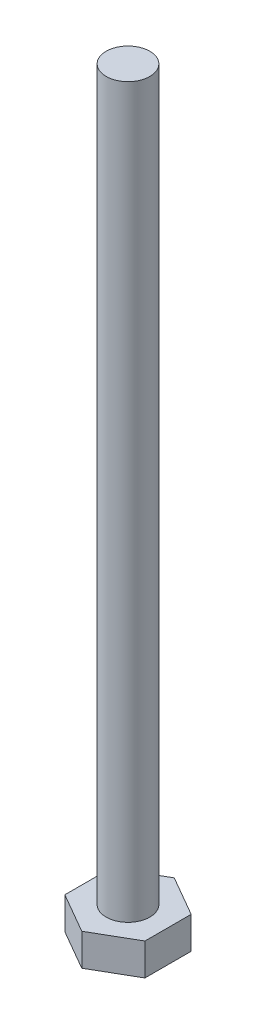
ISO-10303-21;
HEADER;
FILE_DESCRIPTION(('STEP AP214'),'2;1');
FILE_NAME('part.step','',(''),(''),'','','');
FILE_SCHEMA(('AUTOMOTIVE_DESIGN { 1 0 10303 214 1 1 1 1 }'));
ENDSEC;
DATA;
#1=APPLICATION_CONTEXT('core data for automotive mechanical design processes');
#2=APPLICATION_PROTOCOL_DEFINITION('international standard','automotive_design',2000,#1);
#3=PRODUCT_CONTEXT('',#1,'mechanical');
#4=PRODUCT('Part','Part','',(#3));
#5=PRODUCT_RELATED_PRODUCT_CATEGORY('part','',(#4));
#6=PRODUCT_DEFINITION_FORMATION('','',#4);
#7=PRODUCT_DEFINITION_CONTEXT('part definition',#1,'design');
#8=PRODUCT_DEFINITION('design','',#6,#7);
#9=PRODUCT_DEFINITION_SHAPE('','',#8);
#10=(LENGTH_UNIT() NAMED_UNIT(*) SI_UNIT(.MILLI.,.METRE.));
#11=(NAMED_UNIT(*) PLANE_ANGLE_UNIT() SI_UNIT($,.RADIAN.));
#12=(NAMED_UNIT(*) SI_UNIT($,.STERADIAN.) SOLID_ANGLE_UNIT());
#13=UNCERTAINTY_MEASURE_WITH_UNIT(LENGTH_MEASURE(1.E-05),#10,'distance_accuracy_value','');
#14=(GEOMETRIC_REPRESENTATION_CONTEXT(3) GLOBAL_UNCERTAINTY_ASSIGNED_CONTEXT((#13)) GLOBAL_UNIT_ASSIGNED_CONTEXT((#10,
#11,#12)) REPRESENTATION_CONTEXT('',''));
#15=CARTESIAN_POINT('',(0.,0.,0.));
#16=DIRECTION('',(0.,0.,1.));
#17=DIRECTION('',(1.,0.,0.));
#18=AXIS2_PLACEMENT_3D('',#15,#16,#17);
#19=CARTESIAN_POINT('',(0.,50.,0.));
#20=DIRECTION('',(0.,-1.,0.));
#21=DIRECTION('',(0.,0.,-1.));
#22=AXIS2_PLACEMENT_3D('',#19,#20,#21);
#23=CYLINDRICAL_SURFACE('',#22,1.5);
#24=CARTESIAN_POINT('',(0.,50.,0.));
#25=DIRECTION('',(0.,1.,0.));
#26=DIRECTION('',(0.,0.,1.));
#27=AXIS2_PLACEMENT_3D('',#24,#25,#26);
#28=CIRCLE('',#27,1.5);
#29=CARTESIAN_POINT('',(0.,50.,1.5));
#30=VERTEX_POINT('',#29);
#31=EDGE_CURVE('E11',#30,#30,#28,.T.);
#32=ORIENTED_EDGE('',*,*,#31,.F.);
#33=EDGE_LOOP('',(#32));
#34=FACE_BOUND('',#33,.T.);
#35=CARTESIAN_POINT('',(0.,0.,0.));
#36=DIRECTION('',(0.,1.,0.));
#37=DIRECTION('',(0.,0.,1.));
#38=AXIS2_PLACEMENT_3D('',#35,#36,#37);
#39=CIRCLE('',#38,1.5);
#40=CARTESIAN_POINT('',(0.,0.,1.5));
#41=VERTEX_POINT('',#40);
#42=EDGE_CURVE('E45',#41,#41,#39,.T.);
#43=ORIENTED_EDGE('',*,*,#42,.T.);
#44=EDGE_LOOP('',(#43));
#45=FACE_BOUND('',#44,.T.);
#46=ADVANCED_FACE('F37',(#34,#45),#23,.T.);
#47=CARTESIAN_POINT('',(0.,50.,0.));
#48=DIRECTION('',(0.,1.,0.));
#49=DIRECTION('',(0.,0.,1.));
#50=AXIS2_PLACEMENT_3D('',#47,#48,#49);
#51=PLANE('',#50);
#52=ORIENTED_EDGE('',*,*,#31,.T.);
#53=EDGE_LOOP('',(#52));
#54=FACE_BOUND('',#53,.T.);
#55=ADVANCED_FACE('F166',(#54),#51,.T.);
#56=CARTESIAN_POINT('',(-2.75000000000002,-2.2,0.));
#57=DIRECTION('',(-1.,0.,0.));
#58=DIRECTION('',(0.,0.,1.));
#59=AXIS2_PLACEMENT_3D('',#56,#57,#58);
#60=PLANE('',#59);
#61=DIRECTION('',(0.,0.,1.));
#62=VECTOR('',#61,1.);
#63=CARTESIAN_POINT('',(-2.75000000000002,0.,0.));
#64=LINE('',#63,#62);
#65=CARTESIAN_POINT('',(-2.75000000000002,0.,-1.58771324027148));
#66=VERTEX_POINT('',#65);
#67=CARTESIAN_POINT('',(-2.75000000000002,0.,1.58771324027148));
#68=VERTEX_POINT('',#67);
#69=EDGE_CURVE('E124',#66,#68,#64,.T.);
#70=ORIENTED_EDGE('',*,*,#69,.F.);
#71=DIRECTION('',(0.,1.,0.));
#72=VECTOR('',#71,1.);
#73=CARTESIAN_POINT('',(-2.75000000000002,-2.2,-1.58771324027148));
#74=LINE('',#73,#72);
#75=CARTESIAN_POINT('',(-2.75000000000002,-2.2,-1.58771324027148));
#76=VERTEX_POINT('',#75);
#77=EDGE_CURVE('E53',#76,#66,#74,.T.);
#78=ORIENTED_EDGE('',*,*,#77,.F.);
#79=DIRECTION('',(0.,0.,1.));
#80=VECTOR('',#79,1.);
#81=CARTESIAN_POINT('',(-2.75000000000002,-2.2,0.));
#82=LINE('',#81,#80);
#83=CARTESIAN_POINT('',(-2.75000000000002,-2.2,1.58771324027148));
#84=VERTEX_POINT('',#83);
#85=EDGE_CURVE('E139',#76,#84,#82,.T.);
#86=ORIENTED_EDGE('',*,*,#85,.T.);
#87=DIRECTION('',(0.,1.,0.));
#88=VECTOR('',#87,1.);
#89=CARTESIAN_POINT('',(-2.75000000000002,-2.2,1.58771324027148));
#90=LINE('',#89,#88);
#91=EDGE_CURVE('E88',#84,#68,#90,.T.);
#92=ORIENTED_EDGE('',*,*,#91,.T.);
#93=EDGE_LOOP('',(#70,#78,#86,#92));
#94=FACE_BOUND('',#93,.T.);
#95=ADVANCED_FACE('F153',(#94),#60,.T.);
#96=CARTESIAN_POINT('',(-1.37500000000001,-2.2,-2.38156986040722));
#97=DIRECTION('',(-0.500000000000001,0.,-0.866025403784438));
#98=DIRECTION('',(-0.866025403784438,0.,0.500000000000001));
#99=AXIS2_PLACEMENT_3D('',#96,#97,#98);
#100=PLANE('',#99);
#101=DIRECTION('',(-0.866025403784438,0.,0.500000000000001));
#102=VECTOR('',#101,1.);
#103=CARTESIAN_POINT('',(-1.37500000000001,0.,-2.38156986040722));
#104=LINE('',#103,#102);
#105=CARTESIAN_POINT('',(0.,0.,-3.17542648054297));
#106=VERTEX_POINT('',#105);
#107=EDGE_CURVE('E136',#106,#66,#104,.T.);
#108=ORIENTED_EDGE('',*,*,#107,.F.);
#109=DIRECTION('',(0.,1.,0.));
#110=VECTOR('',#109,1.);
#111=CARTESIAN_POINT('',(0.,-2.2,-3.17542648054297));
#112=LINE('',#111,#110);
#113=CARTESIAN_POINT('',(0.,-2.2,-3.17542648054297));
#114=VERTEX_POINT('',#113);
#115=EDGE_CURVE('E76',#114,#106,#112,.T.);
#116=ORIENTED_EDGE('',*,*,#115,.F.);
#117=DIRECTION('',(-0.866025403784438,0.,0.500000000000001));
#118=VECTOR('',#117,1.);
#119=CARTESIAN_POINT('',(-1.37500000000001,-2.2,-2.38156986040722));
#120=LINE('',#119,#118);
#121=EDGE_CURVE('E114',#114,#76,#120,.T.);
#122=ORIENTED_EDGE('',*,*,#121,.T.);
#123=ORIENTED_EDGE('',*,*,#77,.T.);
#124=EDGE_LOOP('',(#108,#116,#122,#123));
#125=FACE_BOUND('',#124,.T.);
#126=ADVANCED_FACE('F158',(#125),#100,.T.);
#127=CARTESIAN_POINT('',(1.37500000000001,-2.2,-2.38156986040723));
#128=DIRECTION('',(0.5,0.,-0.866025403784439));
#129=DIRECTION('',(-0.866025403784439,0.,-0.5));
#130=AXIS2_PLACEMENT_3D('',#127,#128,#129);
#131=PLANE('',#130);
#132=DIRECTION('',(-0.866025403784439,0.,-0.5));
#133=VECTOR('',#132,1.);
#134=CARTESIAN_POINT('',(1.37500000000001,0.,-2.38156986040723));
#135=LINE('',#134,#133);
#136=CARTESIAN_POINT('',(2.75000000000001,0.,-1.5877132402715));
#137=VERTEX_POINT('',#136);
#138=EDGE_CURVE('E101',#137,#106,#135,.T.);
#139=ORIENTED_EDGE('',*,*,#138,.F.);
#140=DIRECTION('',(0.,1.,0.));
#141=VECTOR('',#140,1.);
#142=CARTESIAN_POINT('',(2.75000000000001,-2.2,-1.5877132402715));
#143=LINE('',#142,#141);
#144=CARTESIAN_POINT('',(2.75000000000001,-2.2,-1.5877132402715));
#145=VERTEX_POINT('',#144);
#146=EDGE_CURVE('E96',#145,#137,#143,.T.);
#147=ORIENTED_EDGE('',*,*,#146,.F.);
#148=DIRECTION('',(-0.866025403784439,0.,-0.5));
#149=VECTOR('',#148,1.);
#150=CARTESIAN_POINT('',(1.37500000000001,-2.2,-2.38156986040723));
#151=LINE('',#150,#149);
#152=EDGE_CURVE('E99',#145,#114,#151,.T.);
#153=ORIENTED_EDGE('',*,*,#152,.T.);
#154=ORIENTED_EDGE('',*,*,#115,.T.);
#155=EDGE_LOOP('',(#139,#147,#153,#154));
#156=FACE_BOUND('',#155,.T.);
#157=ADVANCED_FACE('F98',(#156),#131,.T.);
#158=CARTESIAN_POINT('',(2.75000000000001,-2.2,0.));
#159=DIRECTION('',(1.,0.,0.));
#160=DIRECTION('',(0.,0.,-1.));
#161=AXIS2_PLACEMENT_3D('',#158,#159,#160);
#162=PLANE('',#161);
#163=DIRECTION('',(0.,0.,-1.));
#164=VECTOR('',#163,1.);
#165=CARTESIAN_POINT('',(2.75000000000001,0.,0.));
#166=LINE('',#165,#164);
#167=CARTESIAN_POINT('',(2.75000000000001,0.,1.58771324027146));
#168=VERTEX_POINT('',#167);
#169=EDGE_CURVE('E133',#168,#137,#166,.T.);
#170=ORIENTED_EDGE('',*,*,#169,.F.);
#171=DIRECTION('',(0.,1.,0.));
#172=VECTOR('',#171,1.);
#173=CARTESIAN_POINT('',(2.75000000000001,-2.2,1.58771324027146));
#174=LINE('',#173,#172);
#175=CARTESIAN_POINT('',(2.75000000000001,-2.2,1.58771324027146));
#176=VERTEX_POINT('',#175);
#177=EDGE_CURVE('E106',#176,#168,#174,.T.);
#178=ORIENTED_EDGE('',*,*,#177,.F.);
#179=DIRECTION('',(0.,0.,-1.));
#180=VECTOR('',#179,1.);
#181=CARTESIAN_POINT('',(2.75000000000001,-2.2,0.));
#182=LINE('',#181,#180);
#183=EDGE_CURVE('E112',#176,#145,#182,.T.);
#184=ORIENTED_EDGE('',*,*,#183,.T.);
#185=ORIENTED_EDGE('',*,*,#146,.T.);
#186=EDGE_LOOP('',(#170,#178,#184,#185));
#187=FACE_BOUND('',#186,.T.);
#188=ADVANCED_FACE('F116',(#187),#162,.T.);
#189=CARTESIAN_POINT('',(1.375,-2.2,2.3815698604072));
#190=DIRECTION('',(0.499999999999999,0.,0.866025403784439));
#191=DIRECTION('',(0.866025403784439,0.,-0.499999999999999));
#192=AXIS2_PLACEMENT_3D('',#189,#190,#191);
#193=PLANE('',#192);
#194=DIRECTION('',(0.866025403784439,0.,-0.5));
#195=VECTOR('',#194,1.);
#196=CARTESIAN_POINT('',(1.375,0.,2.3815698604072));
#197=LINE('',#196,#195);
#198=CARTESIAN_POINT('',(0.,0.,3.17542648054295));
#199=VERTEX_POINT('',#198);
#200=EDGE_CURVE('E130',#199,#168,#197,.T.);
#201=ORIENTED_EDGE('',*,*,#200,.F.);
#202=DIRECTION('',(0.,1.,0.));
#203=VECTOR('',#202,1.);
#204=CARTESIAN_POINT('',(0.,-2.2,3.17542648054295));
#205=LINE('',#204,#203);
#206=CARTESIAN_POINT('',(0.,-2.2,3.17542648054295));
#207=VERTEX_POINT('',#206);
#208=EDGE_CURVE('E143',#207,#199,#205,.T.);
#209=ORIENTED_EDGE('',*,*,#208,.F.);
#210=DIRECTION('',(0.866025403784439,0.,-0.5));
#211=VECTOR('',#210,1.);
#212=CARTESIAN_POINT('',(1.375,-2.2,2.3815698604072));
#213=LINE('',#212,#211);
#214=EDGE_CURVE('E117',#207,#176,#213,.T.);
#215=ORIENTED_EDGE('',*,*,#214,.T.);
#216=ORIENTED_EDGE('',*,*,#177,.T.);
#217=EDGE_LOOP('',(#201,#209,#215,#216));
#218=FACE_BOUND('',#217,.T.);
#219=ADVANCED_FACE('F157',(#218),#193,.T.);
#220=CARTESIAN_POINT('',(-1.37500000000001,-2.2,2.38156986040722));
#221=DIRECTION('',(-0.5,0.,0.866025403784438));
#222=DIRECTION('',(0.866025403784438,0.,0.5));
#223=AXIS2_PLACEMENT_3D('',#220,#221,#222);
#224=PLANE('',#223);
#225=DIRECTION('',(0.866025403784438,0.,0.5));
#226=VECTOR('',#225,1.);
#227=CARTESIAN_POINT('',(-1.37500000000001,0.,2.38156986040722));
#228=LINE('',#227,#226);
#229=EDGE_CURVE('E127',#68,#199,#228,.T.);
#230=ORIENTED_EDGE('',*,*,#229,.F.);
#231=ORIENTED_EDGE('',*,*,#91,.F.);
#232=DIRECTION('',(0.866025403784438,0.,0.5));
#233=VECTOR('',#232,1.);
#234=CARTESIAN_POINT('',(-1.37500000000001,-2.2,2.38156986040722));
#235=LINE('',#234,#233);
#236=EDGE_CURVE('E119',#84,#207,#235,.T.);
#237=ORIENTED_EDGE('',*,*,#236,.T.);
#238=ORIENTED_EDGE('',*,*,#208,.T.);
#239=EDGE_LOOP('',(#230,#231,#237,#238));
#240=FACE_BOUND('',#239,.T.);
#241=ADVANCED_FACE('F154',(#240),#224,.T.);
#242=CARTESIAN_POINT('',(0.,-2.2,0.));
#243=DIRECTION('',(0.,1.,0.));
#244=DIRECTION('',(0.,0.,1.));
#245=AXIS2_PLACEMENT_3D('',#242,#243,#244);
#246=PLANE('',#245);
#247=ORIENTED_EDGE('',*,*,#85,.F.);
#248=ORIENTED_EDGE('',*,*,#121,.F.);
#249=ORIENTED_EDGE('',*,*,#152,.F.);
#250=ORIENTED_EDGE('',*,*,#183,.F.);
#251=ORIENTED_EDGE('',*,*,#214,.F.);
#252=ORIENTED_EDGE('',*,*,#236,.F.);
#253=EDGE_LOOP('',(#247,#248,#249,#250,#251,#252));
#254=FACE_BOUND('',#253,.T.);
#255=ADVANCED_FACE('F110',(#254),#246,.F.);
#256=CARTESIAN_POINT('',(0.,0.,0.));
#257=DIRECTION('',(0.,1.,0.));
#258=DIRECTION('',(0.,0.,1.));
#259=AXIS2_PLACEMENT_3D('',#256,#257,#258);
#260=PLANE('',#259);
#261=ORIENTED_EDGE('',*,*,#42,.F.);
#262=EDGE_LOOP('',(#261));
#263=FACE_BOUND('',#262,.T.);
#264=ORIENTED_EDGE('',*,*,#69,.T.);
#265=ORIENTED_EDGE('',*,*,#229,.T.);
#266=ORIENTED_EDGE('',*,*,#200,.T.);
#267=ORIENTED_EDGE('',*,*,#169,.T.);
#268=ORIENTED_EDGE('',*,*,#138,.T.);
#269=ORIENTED_EDGE('',*,*,#107,.T.);
#270=EDGE_LOOP('',(#264,#265,#266,#267,#268,#269));
#271=FACE_BOUND('',#270,.T.);
#272=ADVANCED_FACE('F149',(#263,#271),#260,.T.);
#273=CLOSED_SHELL('',(#46,#55,#95,#126,#157,#188,#219,#241,#255,#272));
#274=MANIFOLD_SOLID_BREP('B2',#273);
#275=ADVANCED_BREP_SHAPE_REPRESENTATION('',(#18,#274),#14);
#276=SHAPE_DEFINITION_REPRESENTATION(#9,#275);
ENDSEC;
END-ISO-10303-21;
